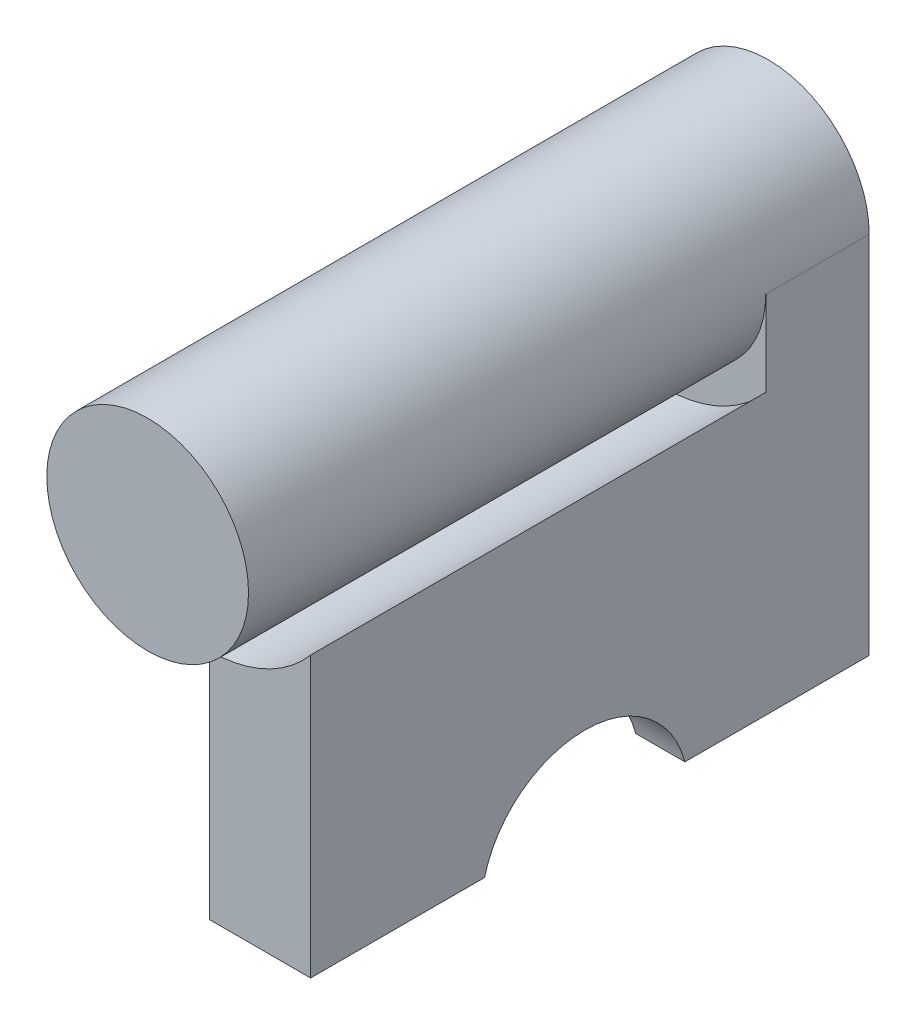
ISO-10303-21;
HEADER;
FILE_DESCRIPTION(('STEP AP214'),'2;1');
FILE_NAME('part.step','',(''),(''),'','','');
FILE_SCHEMA(('AUTOMOTIVE_DESIGN { 1 0 10303 214 1 1 1 1 }'));
ENDSEC;
DATA;
#1=APPLICATION_CONTEXT('core data for automotive mechanical design processes');
#2=APPLICATION_PROTOCOL_DEFINITION('international standard','automotive_design',2000,#1);
#3=PRODUCT_CONTEXT('',#1,'mechanical');
#4=PRODUCT('Part','Part','',(#3));
#5=PRODUCT_RELATED_PRODUCT_CATEGORY('part','',(#4));
#6=PRODUCT_DEFINITION_FORMATION('','',#4);
#7=PRODUCT_DEFINITION_CONTEXT('part definition',#1,'design');
#8=PRODUCT_DEFINITION('design','',#6,#7);
#9=PRODUCT_DEFINITION_SHAPE('','',#8);
#10=(LENGTH_UNIT() NAMED_UNIT(*) SI_UNIT(.MILLI.,.METRE.));
#11=(NAMED_UNIT(*) PLANE_ANGLE_UNIT() SI_UNIT($,.RADIAN.));
#12=(NAMED_UNIT(*) SI_UNIT($,.STERADIAN.) SOLID_ANGLE_UNIT());
#13=UNCERTAINTY_MEASURE_WITH_UNIT(LENGTH_MEASURE(1.E-05),#10,'distance_accuracy_value','');
#14=(GEOMETRIC_REPRESENTATION_CONTEXT(3) GLOBAL_UNCERTAINTY_ASSIGNED_CONTEXT((#13)) GLOBAL_UNIT_ASSIGNED_CONTEXT((#10,
#11,#12)) REPRESENTATION_CONTEXT('',''));
#15=CARTESIAN_POINT('',(0.,0.,0.));
#16=DIRECTION('',(0.,0.,1.));
#17=DIRECTION('',(1.,0.,0.));
#18=AXIS2_PLACEMENT_3D('',#15,#16,#17);
#19=CARTESIAN_POINT('',(17.,-7.55,5.5));
#20=DIRECTION('',(-1.,0.,0.));
#21=DIRECTION('',(0.,0.,1.));
#22=AXIS2_PLACEMENT_3D('',#19,#20,#21);
#23=CYLINDRICAL_SURFACE('',#22,2.);
#24=CARTESIAN_POINT('',(1.,-7.55,5.5));
#25=DIRECTION('',(-1.,0.,0.));
#26=DIRECTION('',(0.,0.,1.));
#27=AXIS2_PLACEMENT_3D('',#24,#25,#26);
#28=CIRCLE('',#27,2.);
#29=CARTESIAN_POINT('',(1.,-7.05,3.56350832689629));
#30=VERTEX_POINT('',#29);
#31=CARTESIAN_POINT('',(1.,-7.05,7.43649167310371));
#32=VERTEX_POINT('',#31);
#33=EDGE_CURVE('E46',#30,#32,#28,.F.);
#34=ORIENTED_EDGE('',*,*,#33,.F.);
#35=DIRECTION('',(-1.,0.,0.));
#36=VECTOR('',#35,1.);
#37=CARTESIAN_POINT('',(17.,-7.05,3.56350832689629));
#38=LINE('',#37,#36);
#39=CARTESIAN_POINT('',(1.95,-7.05,3.56350832689629));
#40=VERTEX_POINT('',#39);
#41=EDGE_CURVE('E170',#40,#30,#38,.T.);
#42=ORIENTED_EDGE('',*,*,#41,.F.);
#43=CARTESIAN_POINT('',(1.95,-7.55,5.5));
#44=DIRECTION('',(1.,0.,0.));
#45=DIRECTION('',(0.,0.,-1.));
#46=AXIS2_PLACEMENT_3D('',#43,#44,#45);
#47=CIRCLE('',#46,2.);
#48=CARTESIAN_POINT('',(1.95,-7.05,7.43649167310371));
#49=VERTEX_POINT('',#48);
#50=EDGE_CURVE('E179',#40,#49,#47,.T.);
#51=ORIENTED_EDGE('',*,*,#50,.T.);
#52=DIRECTION('',(-1.,0.,0.));
#53=VECTOR('',#52,1.);
#54=CARTESIAN_POINT('',(17.,-7.05,7.43649167310371));
#55=LINE('',#54,#53);
#56=EDGE_CURVE('E61',#32,#49,#55,.F.);
#57=ORIENTED_EDGE('',*,*,#56,.F.);
#58=EDGE_LOOP('',(#34,#42,#51,#57));
#59=FACE_BOUND('',#58,.T.);
#60=ADVANCED_FACE('F38',(#59),#23,.F.);
#61=CARTESIAN_POINT('',(1.95,-7.05,2.));
#62=DIRECTION('',(0.,1.,0.));
#63=DIRECTION('',(0.,0.,1.));
#64=AXIS2_PLACEMENT_3D('',#61,#62,#63);
#65=PLANE('',#64);
#66=DIRECTION('',(0.,0.,1.));
#67=VECTOR('',#66,1.);
#68=CARTESIAN_POINT('',(1.,-7.05,2.));
#69=LINE('',#68,#67);
#70=CARTESIAN_POINT('',(1.,-7.05,2.8008500853417));
#71=VERTEX_POINT('',#70);
#72=EDGE_CURVE('E53',#71,#30,#69,.T.);
#73=ORIENTED_EDGE('',*,*,#72,.F.);
#74=DIRECTION('',(-1.,0.,0.));
#75=VECTOR('',#74,1.);
#76=CARTESIAN_POINT('',(1.,-7.05,2.8008500853417));
#77=LINE('',#76,#75);
#78=CARTESIAN_POINT('',(0.,-7.05,2.8008500853417));
#79=VERTEX_POINT('',#78);
#80=EDGE_CURVE('E181',#71,#79,#77,.T.);
#81=ORIENTED_EDGE('',*,*,#80,.T.);
#82=DIRECTION('',(0.,0.,-1.));
#83=VECTOR('',#82,1.);
#84=CARTESIAN_POINT('',(0.,-7.05,2.));
#85=LINE('',#84,#83);
#86=CARTESIAN_POINT('',(0.,-7.05,0.));
#87=VERTEX_POINT('',#86);
#88=EDGE_CURVE('E150',#79,#87,#85,.T.);
#89=ORIENTED_EDGE('',*,*,#88,.T.);
#90=DIRECTION('',(-1.,0.,0.));
#91=VECTOR('',#90,1.);
#92=CARTESIAN_POINT('',(1.95,-7.05,0.));
#93=LINE('',#92,#91);
#94=CARTESIAN_POINT('',(1.95,-7.05,0.));
#95=VERTEX_POINT('',#94);
#96=EDGE_CURVE('E159',#95,#87,#93,.T.);
#97=ORIENTED_EDGE('',*,*,#96,.F.);
#98=DIRECTION('',(0.,0.,-1.));
#99=VECTOR('',#98,1.);
#100=CARTESIAN_POINT('',(1.95,-7.05,2.));
#101=LINE('',#100,#99);
#102=EDGE_CURVE('E143',#40,#95,#101,.T.);
#103=ORIENTED_EDGE('',*,*,#102,.F.);
#104=ORIENTED_EDGE('',*,*,#41,.T.);
#105=EDGE_LOOP('',(#73,#81,#89,#97,#103,#104));
#106=FACE_BOUND('',#105,.T.);
#107=ADVANCED_FACE('F220',(#106),#65,.F.);
#108=CARTESIAN_POINT('',(0.,0.,12.));
#109=DIRECTION('',(0.,0.,-1.));
#110=DIRECTION('',(-1.,0.,0.));
#111=AXIS2_PLACEMENT_3D('',#108,#109,#110);
#112=CYLINDRICAL_SURFACE('',#111,1.95);
#113=CARTESIAN_POINT('',(0.,0.,2.));
#114=DIRECTION('',(0.,0.,-1.));
#115=DIRECTION('',(0.,1.,0.));
#116=AXIS2_PLACEMENT_3D('',#113,#114,#115);
#117=CIRCLE('',#116,1.95);
#118=CARTESIAN_POINT('',(1.95,0.,2.));
#119=VERTEX_POINT('',#118);
#120=CARTESIAN_POINT('',(0.,-1.95,2.));
#121=VERTEX_POINT('',#120);
#122=EDGE_CURVE('E134',#119,#121,#117,.T.);
#123=ORIENTED_EDGE('',*,*,#122,.F.);
#124=DIRECTION('',(0.,0.,1.));
#125=VECTOR('',#124,1.);
#126=CARTESIAN_POINT('',(1.95,0.,0.));
#127=LINE('',#126,#125);
#128=CARTESIAN_POINT('',(1.95,0.,0.));
#129=VERTEX_POINT('',#128);
#130=EDGE_CURVE('E131',#129,#119,#127,.T.);
#131=ORIENTED_EDGE('',*,*,#130,.F.);
#132=CARTESIAN_POINT('',(0.,0.,0.));
#133=DIRECTION('',(0.,0.,1.));
#134=DIRECTION('',(1.,0.,0.));
#135=AXIS2_PLACEMENT_3D('',#132,#133,#134);
#136=CIRCLE('',#135,1.95);
#137=CARTESIAN_POINT('',(0.,-1.95,0.));
#138=VERTEX_POINT('',#137);
#139=EDGE_CURVE('E117',#129,#138,#136,.T.);
#140=ORIENTED_EDGE('',*,*,#139,.T.);
#141=DIRECTION('',(0.,0.,-1.));
#142=VECTOR('',#141,1.);
#143=CARTESIAN_POINT('',(0.,-1.95,12.));
#144=LINE('',#143,#142);
#145=EDGE_CURVE('E128',#121,#138,#144,.T.);
#146=ORIENTED_EDGE('',*,*,#145,.F.);
#147=EDGE_LOOP('',(#123,#131,#140,#146));
#148=FACE_BOUND('',#147,.T.);
#149=CARTESIAN_POINT('',(0.,0.,12.));
#150=DIRECTION('',(0.,0.,1.));
#151=DIRECTION('',(1.,0.,0.));
#152=AXIS2_PLACEMENT_3D('',#149,#150,#151);
#153=CIRCLE('',#152,1.95);
#154=CARTESIAN_POINT('',(1.95,0.,12.));
#155=VERTEX_POINT('',#154);
#156=EDGE_CURVE('E127',#155,#155,#153,.T.);
#157=ORIENTED_EDGE('',*,*,#156,.F.);
#158=EDGE_LOOP('',(#157));
#159=FACE_BOUND('',#158,.T.);
#160=ADVANCED_FACE('F40',(#148,#159),#112,.T.);
#161=CARTESIAN_POINT('',(0.,0.,12.));
#162=DIRECTION('',(0.,0.,1.));
#163=DIRECTION('',(1.,0.,0.));
#164=AXIS2_PLACEMENT_3D('',#161,#162,#163);
#165=PLANE('',#164);
#166=ORIENTED_EDGE('',*,*,#156,.T.);
#167=EDGE_LOOP('',(#166));
#168=FACE_BOUND('',#167,.T.);
#169=ADVANCED_FACE('F247',(#168),#165,.T.);
#170=CARTESIAN_POINT('',(0.,0.,0.));
#171=DIRECTION('',(0.,0.,1.));
#172=DIRECTION('',(1.,0.,0.));
#173=AXIS2_PLACEMENT_3D('',#170,#171,#172);
#174=PLANE('',#173);
#175=ORIENTED_EDGE('',*,*,#139,.F.);
#176=DIRECTION('',(0.,1.,0.));
#177=VECTOR('',#176,1.);
#178=CARTESIAN_POINT('',(1.95,1.95,0.));
#179=LINE('',#178,#177);
#180=EDGE_CURVE('E122',#95,#129,#179,.T.);
#181=ORIENTED_EDGE('',*,*,#180,.F.);
#182=ORIENTED_EDGE('',*,*,#96,.T.);
#183=DIRECTION('',(0.,1.,0.));
#184=VECTOR('',#183,1.);
#185=CARTESIAN_POINT('',(0.,1.95,0.));
#186=LINE('',#185,#184);
#187=EDGE_CURVE('E124',#87,#138,#186,.T.);
#188=ORIENTED_EDGE('',*,*,#187,.T.);
#189=EDGE_LOOP('',(#175,#181,#182,#188));
#190=FACE_BOUND('',#189,.T.);
#191=ADVANCED_FACE('F119',(#190),#174,.F.);
#192=CARTESIAN_POINT('',(1.95,0.,0.));
#193=DIRECTION('',(1.,0.,0.));
#194=DIRECTION('',(0.,0.,-1.));
#195=AXIS2_PLACEMENT_3D('',#192,#193,#194);
#196=PLANE('',#195);
#197=ORIENTED_EDGE('',*,*,#130,.T.);
#198=DIRECTION('',(0.,-1.,0.));
#199=VECTOR('',#198,1.);
#200=CARTESIAN_POINT('',(1.95,1.95,2.));
#201=LINE('',#200,#199);
#202=CARTESIAN_POINT('',(1.95,-1.6431676725155,2.));
#203=VERTEX_POINT('',#202);
#204=EDGE_CURVE('E145',#119,#203,#201,.T.);
#205=ORIENTED_EDGE('',*,*,#204,.T.);
#206=DIRECTION('',(0.,0.,-1.));
#207=VECTOR('',#206,1.);
#208=CARTESIAN_POINT('',(1.95,-1.6431676725155,10.8));
#209=LINE('',#208,#207);
#210=CARTESIAN_POINT('',(1.95,-1.6431676725155,10.8));
#211=VERTEX_POINT('',#210);
#212=EDGE_CURVE('E196',#211,#203,#209,.T.);
#213=ORIENTED_EDGE('',*,*,#212,.F.);
#214=DIRECTION('',(0.,1.,0.));
#215=VECTOR('',#214,1.);
#216=CARTESIAN_POINT('',(1.95,0.,10.8));
#217=LINE('',#216,#215);
#218=CARTESIAN_POINT('',(1.95,-7.05,10.8));
#219=VERTEX_POINT('',#218);
#220=EDGE_CURVE('E185',#219,#211,#217,.T.);
#221=ORIENTED_EDGE('',*,*,#220,.F.);
#222=EDGE_CURVE('E156',#219,#49,#101,.T.);
#223=ORIENTED_EDGE('',*,*,#222,.T.);
#224=ORIENTED_EDGE('',*,*,#50,.F.);
#225=ORIENTED_EDGE('',*,*,#102,.T.);
#226=ORIENTED_EDGE('',*,*,#180,.T.);
#227=EDGE_LOOP('',(#197,#205,#213,#221,#223,#224,#225,#226));
#228=FACE_BOUND('',#227,.T.);
#229=ADVANCED_FACE('F140',(#228),#196,.T.);
#230=CARTESIAN_POINT('',(0.,0.,0.));
#231=DIRECTION('',(1.,0.,0.));
#232=DIRECTION('',(0.,0.,-1.));
#233=AXIS2_PLACEMENT_3D('',#230,#231,#232);
#234=PLANE('',#233);
#235=ORIENTED_EDGE('',*,*,#88,.F.);
#236=CARTESIAN_POINT('',(0.,-7.55,5.50501354193969));
#237=DIRECTION('',(-1.,0.,0.));
#238=DIRECTION('',(0.,0.,1.));
#239=AXIS2_PLACEMENT_3D('',#236,#237,#238);
#240=CIRCLE('',#239,2.75);
#241=CARTESIAN_POINT('',(0.,-7.05,8.20917699853768));
#242=VERTEX_POINT('',#241);
#243=EDGE_CURVE('E138',#242,#79,#240,.T.);
#244=ORIENTED_EDGE('',*,*,#243,.F.);
#245=CARTESIAN_POINT('',(0.,-7.05,10.8));
#246=VERTEX_POINT('',#245);
#247=EDGE_CURVE('E146',#246,#242,#85,.T.);
#248=ORIENTED_EDGE('',*,*,#247,.F.);
#249=DIRECTION('',(0.,-1.,0.));
#250=VECTOR('',#249,1.);
#251=CARTESIAN_POINT('',(0.,0.,10.8));
#252=LINE('',#251,#250);
#253=CARTESIAN_POINT('',(0.,-2.55,10.8));
#254=VERTEX_POINT('',#253);
#255=EDGE_CURVE('E194',#254,#246,#252,.T.);
#256=ORIENTED_EDGE('',*,*,#255,.F.);
#257=DIRECTION('',(0.,0.,-1.));
#258=VECTOR('',#257,1.);
#259=CARTESIAN_POINT('',(0.,-2.55,10.8));
#260=LINE('',#259,#258);
#261=CARTESIAN_POINT('',(0.,-2.55,2.));
#262=VERTEX_POINT('',#261);
#263=EDGE_CURVE('E153',#254,#262,#260,.T.);
#264=ORIENTED_EDGE('',*,*,#263,.T.);
#265=DIRECTION('',(0.,-1.,0.));
#266=VECTOR('',#265,1.);
#267=CARTESIAN_POINT('',(0.,1.95,2.));
#268=LINE('',#267,#266);
#269=EDGE_CURVE('E161',#121,#262,#268,.T.);
#270=ORIENTED_EDGE('',*,*,#269,.F.);
#271=ORIENTED_EDGE('',*,*,#145,.T.);
#272=ORIENTED_EDGE('',*,*,#187,.F.);
#273=EDGE_LOOP('',(#235,#244,#248,#256,#264,#270,#271,#272));
#274=FACE_BOUND('',#273,.T.);
#275=ADVANCED_FACE('F209',(#274),#234,.F.);
#276=CARTESIAN_POINT('',(1.95,1.95,2.));
#277=DIRECTION('',(0.,0.,-1.));
#278=DIRECTION('',(0.,1.,0.));
#279=AXIS2_PLACEMENT_3D('',#276,#277,#278);
#280=PLANE('',#279);
#281=ORIENTED_EDGE('',*,*,#269,.T.);
#282=CARTESIAN_POINT('',(0.,0.,2.));
#283=DIRECTION('',(0.,0.,1.));
#284=DIRECTION('',(1.,0.,0.));
#285=AXIS2_PLACEMENT_3D('',#282,#283,#284);
#286=CIRCLE('',#285,2.55);
#287=EDGE_CURVE('E180',#262,#203,#286,.T.);
#288=ORIENTED_EDGE('',*,*,#287,.T.);
#289=ORIENTED_EDGE('',*,*,#204,.F.);
#290=ORIENTED_EDGE('',*,*,#122,.T.);
#291=EDGE_LOOP('',(#281,#288,#289,#290));
#292=FACE_BOUND('',#291,.T.);
#293=ADVANCED_FACE('F212',(#292),#280,.F.);
#294=ORIENTED_EDGE('',*,*,#247,.T.);
#295=DIRECTION('',(-1.,0.,0.));
#296=VECTOR('',#295,1.);
#297=CARTESIAN_POINT('',(1.,-7.05,8.20917699853768));
#298=LINE('',#297,#296);
#299=CARTESIAN_POINT('',(1.,-7.05,8.20917699853768));
#300=VERTEX_POINT('',#299);
#301=EDGE_CURVE('E11',#242,#300,#298,.F.);
#302=ORIENTED_EDGE('',*,*,#301,.T.);
#303=DIRECTION('',(0.,0.,1.));
#304=VECTOR('',#303,1.);
#305=CARTESIAN_POINT('',(1.,-7.05,2.));
#306=LINE('',#305,#304);
#307=EDGE_CURVE('E173',#32,#300,#306,.T.);
#308=ORIENTED_EDGE('',*,*,#307,.F.);
#309=ORIENTED_EDGE('',*,*,#56,.T.);
#310=ORIENTED_EDGE('',*,*,#222,.F.);
#311=DIRECTION('',(1.,0.,0.));
#312=VECTOR('',#311,1.);
#313=CARTESIAN_POINT('',(0.,-7.05,10.8));
#314=LINE('',#313,#312);
#315=EDGE_CURVE('E188',#246,#219,#314,.T.);
#316=ORIENTED_EDGE('',*,*,#315,.F.);
#317=EDGE_LOOP('',(#294,#302,#308,#309,#310,#316));
#318=FACE_BOUND('',#317,.T.);
#319=ADVANCED_FACE('F176',(#318),#65,.F.);
#320=CARTESIAN_POINT('',(0.,0.,10.8));
#321=DIRECTION('',(0.,0.,-1.));
#322=DIRECTION('',(-1.,0.,0.));
#323=AXIS2_PLACEMENT_3D('',#320,#321,#322);
#324=CYLINDRICAL_SURFACE('',#323,2.55);
#325=ORIENTED_EDGE('',*,*,#287,.F.);
#326=ORIENTED_EDGE('',*,*,#263,.F.);
#327=CARTESIAN_POINT('',(0.,0.,10.8));
#328=DIRECTION('',(0.,0.,1.));
#329=DIRECTION('',(1.,0.,0.));
#330=AXIS2_PLACEMENT_3D('',#327,#328,#329);
#331=CIRCLE('',#330,2.55);
#332=EDGE_CURVE('E198',#254,#211,#331,.T.);
#333=ORIENTED_EDGE('',*,*,#332,.T.);
#334=ORIENTED_EDGE('',*,*,#212,.T.);
#335=EDGE_LOOP('',(#325,#326,#333,#334));
#336=FACE_BOUND('',#335,.T.);
#337=ADVANCED_FACE('F210',(#336),#324,.F.);
#338=CARTESIAN_POINT('',(0.,0.,10.8));
#339=DIRECTION('',(0.,0.,1.));
#340=DIRECTION('',(1.,0.,0.));
#341=AXIS2_PLACEMENT_3D('',#338,#339,#340);
#342=PLANE('',#341);
#343=ORIENTED_EDGE('',*,*,#332,.F.);
#344=ORIENTED_EDGE('',*,*,#255,.T.);
#345=ORIENTED_EDGE('',*,*,#315,.T.);
#346=ORIENTED_EDGE('',*,*,#220,.T.);
#347=EDGE_LOOP('',(#343,#344,#345,#346));
#348=FACE_BOUND('',#347,.T.);
#349=ADVANCED_FACE('F192',(#348),#342,.T.);
#350=CARTESIAN_POINT('',(1.,-7.55,5.50501354193969));
#351=DIRECTION('',(-1.,0.,0.));
#352=DIRECTION('',(0.,0.,1.));
#353=AXIS2_PLACEMENT_3D('',#350,#351,#352);
#354=CYLINDRICAL_SURFACE('',#353,2.75);
#355=CARTESIAN_POINT('',(1.,-7.55,5.50501354193969));
#356=DIRECTION('',(-1.,0.,0.));
#357=DIRECTION('',(0.,0.,1.));
#358=AXIS2_PLACEMENT_3D('',#355,#356,#357);
#359=CIRCLE('',#358,2.75);
#360=EDGE_CURVE('E177',#300,#71,#359,.T.);
#361=ORIENTED_EDGE('',*,*,#360,.F.);
#362=ORIENTED_EDGE('',*,*,#301,.F.);
#363=ORIENTED_EDGE('',*,*,#243,.T.);
#364=ORIENTED_EDGE('',*,*,#80,.F.);
#365=EDGE_LOOP('',(#361,#362,#363,#364));
#366=FACE_BOUND('',#365,.T.);
#367=ADVANCED_FACE('F222',(#366),#354,.F.);
#368=CARTESIAN_POINT('',(1.,-7.55,5.50501354193969));
#369=DIRECTION('',(-1.,0.,0.));
#370=DIRECTION('',(0.,0.,1.));
#371=AXIS2_PLACEMENT_3D('',#368,#369,#370);
#372=PLANE('',#371);
#373=ORIENTED_EDGE('',*,*,#72,.T.);
#374=ORIENTED_EDGE('',*,*,#33,.T.);
#375=ORIENTED_EDGE('',*,*,#307,.T.);
#376=ORIENTED_EDGE('',*,*,#360,.T.);
#377=EDGE_LOOP('',(#373,#374,#375,#376));
#378=FACE_BOUND('',#377,.T.);
#379=ADVANCED_FACE('F172',(#378),#372,.T.);
#380=CLOSED_SHELL('',(#60,#107,#160,#169,#191,#229,#275,#293,#319,#337,#349,#367,#379));
#381=MANIFOLD_SOLID_BREP('B2',#380);
#382=ADVANCED_BREP_SHAPE_REPRESENTATION('',(#18,#381),#14);
#383=SHAPE_DEFINITION_REPRESENTATION(#9,#382);
ENDSEC;
END-ISO-10303-21;
